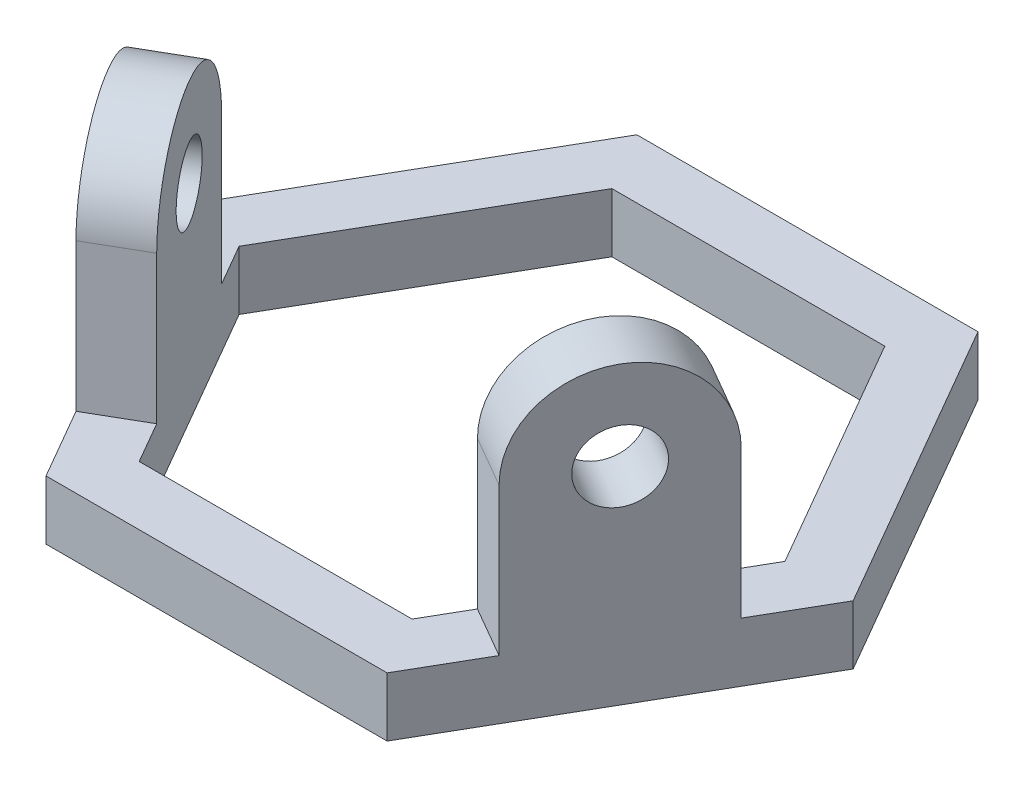
ISO-10303-21;
HEADER;
FILE_DESCRIPTION(('STEP AP214'),'2;1');
FILE_NAME('part.step','',(''),(''),'','','');
FILE_SCHEMA(('AUTOMOTIVE_DESIGN { 1 0 10303 214 1 1 1 1 }'));
ENDSEC;
DATA;
#1=APPLICATION_CONTEXT('core data for automotive mechanical design processes');
#2=APPLICATION_PROTOCOL_DEFINITION('international standard','automotive_design',2000,#1);
#3=PRODUCT_CONTEXT('',#1,'mechanical');
#4=PRODUCT('Part','Part','',(#3));
#5=PRODUCT_RELATED_PRODUCT_CATEGORY('part','',(#4));
#6=PRODUCT_DEFINITION_FORMATION('','',#4);
#7=PRODUCT_DEFINITION_CONTEXT('part definition',#1,'design');
#8=PRODUCT_DEFINITION('design','',#6,#7);
#9=PRODUCT_DEFINITION_SHAPE('','',#8);
#10=(LENGTH_UNIT() NAMED_UNIT(*) SI_UNIT(.MILLI.,.METRE.));
#11=(NAMED_UNIT(*) PLANE_ANGLE_UNIT() SI_UNIT($,.RADIAN.));
#12=(NAMED_UNIT(*) SI_UNIT($,.STERADIAN.) SOLID_ANGLE_UNIT());
#13=UNCERTAINTY_MEASURE_WITH_UNIT(LENGTH_MEASURE(1.E-05),#10,'distance_accuracy_value','');
#14=(GEOMETRIC_REPRESENTATION_CONTEXT(3) GLOBAL_UNCERTAINTY_ASSIGNED_CONTEXT((#13)) GLOBAL_UNIT_ASSIGNED_CONTEXT((#10,
#11,#12)) REPRESENTATION_CONTEXT('',''));
#15=CARTESIAN_POINT('',(0.,0.,0.));
#16=DIRECTION('',(0.,0.,1.));
#17=DIRECTION('',(1.,0.,0.));
#18=AXIS2_PLACEMENT_3D('',#15,#16,#17);
#19=CARTESIAN_POINT('',(0.,10.,0.));
#20=DIRECTION('',(0.,1.,0.));
#21=DIRECTION('',(0.,0.,1.));
#22=AXIS2_PLACEMENT_3D('',#19,#20,#21);
#23=PLANE('',#22);
#24=DIRECTION('',(0.5,0.,0.866025403784439));
#25=VECTOR('',#24,1.);
#26=CARTESIAN_POINT('',(-57.7350269189626,10.,0.));
#27=LINE('',#26,#25);
#28=CARTESIAN_POINT('',(-57.7350269189626,10.,0.));
#29=VERTEX_POINT('',#28);
#30=CARTESIAN_POINT('',(-50.801270189222,10.,12.0096189432334));
#31=VERTEX_POINT('',#30);
#32=EDGE_CURVE('E354',#29,#31,#27,.T.);
#33=ORIENTED_EDGE('',*,*,#32,.T.);
#34=DIRECTION('',(-0.866025403784438,0.,0.5));
#35=VECTOR('',#34,1.);
#36=CARTESIAN_POINT('',(-42.1410161513776,10.,7.00961894323344));
#37=LINE('',#36,#35);
#38=CARTESIAN_POINT('',(-42.1410161513776,10.,7.00961894323344));
#39=VERTEX_POINT('',#38);
#40=EDGE_CURVE('E224',#39,#31,#37,.T.);
#41=ORIENTED_EDGE('',*,*,#40,.F.);
#42=DIRECTION('',(0.5,0.,0.866025403784439));
#43=VECTOR('',#42,1.);
#44=CARTESIAN_POINT('',(-46.1880215351701,10.,0.));
#45=LINE('',#44,#43);
#46=CARTESIAN_POINT('',(-46.1880215351701,10.,0.));
#47=VERTEX_POINT('',#46);
#48=EDGE_CURVE('E289',#47,#39,#45,.T.);
#49=ORIENTED_EDGE('',*,*,#48,.F.);
#50=DIRECTION('',(-0.5,0.,0.866025403784439));
#51=VECTOR('',#50,1.);
#52=CARTESIAN_POINT('',(-23.094010767585,10.,-40.));
#53=LINE('',#52,#51);
#54=CARTESIAN_POINT('',(-23.094010767585,10.,-40.));
#55=VERTEX_POINT('',#54);
#56=EDGE_CURVE('E285',#55,#47,#53,.T.);
#57=ORIENTED_EDGE('',*,*,#56,.F.);
#58=DIRECTION('',(-1.,0.,0.));
#59=VECTOR('',#58,1.);
#60=CARTESIAN_POINT('',(23.094010767585,10.,-40.));
#61=LINE('',#60,#59);
#62=CARTESIAN_POINT('',(23.094010767585,10.,-40.));
#63=VERTEX_POINT('',#62);
#64=EDGE_CURVE('E282',#63,#55,#61,.T.);
#65=ORIENTED_EDGE('',*,*,#64,.F.);
#66=DIRECTION('',(-0.5,0.,-0.866025403784438));
#67=VECTOR('',#66,1.);
#68=CARTESIAN_POINT('',(46.1880215351701,10.,0.));
#69=LINE('',#68,#67);
#70=CARTESIAN_POINT('',(46.1880215351701,10.,0.));
#71=VERTEX_POINT('',#70);
#72=EDGE_CURVE('E278',#71,#63,#69,.T.);
#73=ORIENTED_EDGE('',*,*,#72,.F.);
#74=DIRECTION('',(0.5,0.,-0.866025403784439));
#75=VECTOR('',#74,1.);
#76=CARTESIAN_POINT('',(23.094010767585,10.,40.));
#77=LINE('',#76,#75);
#78=CARTESIAN_POINT('',(42.1410161513776,10.,7.00961894323344));
#79=VERTEX_POINT('',#78);
#80=EDGE_CURVE('E279',#79,#71,#77,.T.);
#81=ORIENTED_EDGE('',*,*,#80,.F.);
#82=DIRECTION('',(0.866025403784438,0.,0.5));
#83=VECTOR('',#82,1.);
#84=CARTESIAN_POINT('',(42.1410161513776,10.,7.00961894323344));
#85=LINE('',#84,#83);
#86=CARTESIAN_POINT('',(50.8012701892219,10.,12.0096189432334));
#87=VERTEX_POINT('',#86);
#88=EDGE_CURVE('E252',#79,#87,#85,.T.);
#89=ORIENTED_EDGE('',*,*,#88,.T.);
#90=DIRECTION('',(0.5,0.,-0.866025403784439));
#91=VECTOR('',#90,1.);
#92=CARTESIAN_POINT('',(28.8675134594813,10.,50.));
#93=LINE('',#92,#91);
#94=CARTESIAN_POINT('',(57.7350269189626,10.,0.));
#95=VERTEX_POINT('',#94);
#96=EDGE_CURVE('E344',#87,#95,#93,.T.);
#97=ORIENTED_EDGE('',*,*,#96,.T.);
#98=DIRECTION('',(-0.5,0.,-0.866025403784438));
#99=VECTOR('',#98,1.);
#100=CARTESIAN_POINT('',(57.7350269189626,10.,0.));
#101=LINE('',#100,#99);
#102=CARTESIAN_POINT('',(28.8675134594813,10.,-50.));
#103=VERTEX_POINT('',#102);
#104=EDGE_CURVE('E343',#95,#103,#101,.T.);
#105=ORIENTED_EDGE('',*,*,#104,.T.);
#106=DIRECTION('',(-1.,0.,0.));
#107=VECTOR('',#106,1.);
#108=CARTESIAN_POINT('',(28.8675134594813,10.,-50.));
#109=LINE('',#108,#107);
#110=CARTESIAN_POINT('',(-28.8675134594813,10.,-50.));
#111=VERTEX_POINT('',#110);
#112=EDGE_CURVE('E347',#103,#111,#109,.T.);
#113=ORIENTED_EDGE('',*,*,#112,.T.);
#114=DIRECTION('',(-0.5,0.,0.866025403784439));
#115=VECTOR('',#114,1.);
#116=CARTESIAN_POINT('',(-28.8675134594813,10.,-50.));
#117=LINE('',#116,#115);
#118=EDGE_CURVE('E350',#111,#29,#117,.T.);
#119=ORIENTED_EDGE('',*,*,#118,.T.);
#120=EDGE_LOOP('',(#33,#41,#49,#57,#65,#73,#81,#89,#97,#105,#113,#119));
#121=FACE_BOUND('',#120,.T.);
#122=ADVANCED_FACE('F45',(#121),#23,.T.);
#123=CARTESIAN_POINT('',(-27.1410161513776,10.,32.9903810567665));
#124=VERTEX_POINT('',#123);
#125=CARTESIAN_POINT('',(-23.094010767585,10.,40.));
#126=VERTEX_POINT('',#125);
#127=EDGE_CURVE('E288',#124,#126,#45,.T.);
#128=ORIENTED_EDGE('',*,*,#127,.F.);
#129=DIRECTION('',(-0.866025403784438,0.,0.5));
#130=VECTOR('',#129,1.);
#131=CARTESIAN_POINT('',(-27.1410161513776,10.,32.9903810567666));
#132=LINE('',#131,#130);
#133=CARTESIAN_POINT('',(-35.8012701892219,10.,37.9903810567666));
#134=VERTEX_POINT('',#133);
#135=EDGE_CURVE('E61',#124,#134,#132,.T.);
#136=ORIENTED_EDGE('',*,*,#135,.T.);
#137=CARTESIAN_POINT('',(-28.8675134594813,10.,50.));
#138=VERTEX_POINT('',#137);
#139=EDGE_CURVE('E353',#134,#138,#27,.T.);
#140=ORIENTED_EDGE('',*,*,#139,.T.);
#141=DIRECTION('',(1.,0.,0.));
#142=VECTOR('',#141,1.);
#143=CARTESIAN_POINT('',(-28.8675134594813,10.,50.));
#144=LINE('',#143,#142);
#145=CARTESIAN_POINT('',(28.8675134594813,10.,50.));
#146=VERTEX_POINT('',#145);
#147=EDGE_CURVE('E358',#138,#146,#144,.T.);
#148=ORIENTED_EDGE('',*,*,#147,.T.);
#149=CARTESIAN_POINT('',(35.8012701892219,10.,37.9903810567666));
#150=VERTEX_POINT('',#149);
#151=EDGE_CURVE('E339',#146,#150,#93,.T.);
#152=ORIENTED_EDGE('',*,*,#151,.T.);
#153=DIRECTION('',(0.866025403784438,0.,0.5));
#154=VECTOR('',#153,1.);
#155=CARTESIAN_POINT('',(27.1410161513776,10.,32.9903810567666));
#156=LINE('',#155,#154);
#157=CARTESIAN_POINT('',(27.1410161513776,10.,32.9903810567666));
#158=VERTEX_POINT('',#157);
#159=EDGE_CURVE('E262',#158,#150,#156,.T.);
#160=ORIENTED_EDGE('',*,*,#159,.F.);
#161=CARTESIAN_POINT('',(23.094010767585,10.,40.));
#162=VERTEX_POINT('',#161);
#163=EDGE_CURVE('E274',#162,#158,#77,.T.);
#164=ORIENTED_EDGE('',*,*,#163,.F.);
#165=DIRECTION('',(1.,0.,0.));
#166=VECTOR('',#165,1.);
#167=CARTESIAN_POINT('',(-23.094010767585,10.,40.));
#168=LINE('',#167,#166);
#169=EDGE_CURVE('E292',#126,#162,#168,.T.);
#170=ORIENTED_EDGE('',*,*,#169,.F.);
#171=EDGE_LOOP('',(#128,#136,#140,#148,#152,#160,#164,#170));
#172=FACE_BOUND('',#171,.T.);
#173=ADVANCED_FACE('F467',(#172),#23,.T.);
#174=CARTESIAN_POINT('',(0.,0.,0.));
#175=DIRECTION('',(0.,1.,0.));
#176=DIRECTION('',(0.,0.,1.));
#177=AXIS2_PLACEMENT_3D('',#174,#175,#176);
#178=PLANE('',#177);
#179=DIRECTION('',(0.5,0.,-0.866025403784439));
#180=VECTOR('',#179,1.);
#181=CARTESIAN_POINT('',(28.8675134594813,0.,50.));
#182=LINE('',#181,#180);
#183=CARTESIAN_POINT('',(28.8675134594813,0.,50.));
#184=VERTEX_POINT('',#183);
#185=CARTESIAN_POINT('',(57.7350269189626,0.,0.));
#186=VERTEX_POINT('',#185);
#187=EDGE_CURVE('E338',#184,#186,#182,.T.);
#188=ORIENTED_EDGE('',*,*,#187,.F.);
#189=DIRECTION('',(1.,0.,0.));
#190=VECTOR('',#189,1.);
#191=CARTESIAN_POINT('',(-28.8675134594813,0.,50.));
#192=LINE('',#191,#190);
#193=CARTESIAN_POINT('',(-28.8675134594813,0.,50.));
#194=VERTEX_POINT('',#193);
#195=EDGE_CURVE('E377',#194,#184,#192,.T.);
#196=ORIENTED_EDGE('',*,*,#195,.F.);
#197=DIRECTION('',(0.5,0.,0.866025403784439));
#198=VECTOR('',#197,1.);
#199=CARTESIAN_POINT('',(-57.7350269189626,0.,0.));
#200=LINE('',#199,#198);
#201=CARTESIAN_POINT('',(-57.7350269189626,0.,0.));
#202=VERTEX_POINT('',#201);
#203=EDGE_CURVE('E374',#202,#194,#200,.T.);
#204=ORIENTED_EDGE('',*,*,#203,.F.);
#205=DIRECTION('',(-0.5,0.,0.866025403784439));
#206=VECTOR('',#205,1.);
#207=CARTESIAN_POINT('',(-28.8675134594813,0.,-50.));
#208=LINE('',#207,#206);
#209=CARTESIAN_POINT('',(-28.8675134594813,0.,-50.));
#210=VERTEX_POINT('',#209);
#211=EDGE_CURVE('E371',#210,#202,#208,.T.);
#212=ORIENTED_EDGE('',*,*,#211,.F.);
#213=DIRECTION('',(-1.,0.,0.));
#214=VECTOR('',#213,1.);
#215=CARTESIAN_POINT('',(28.8675134594813,0.,-50.));
#216=LINE('',#215,#214);
#217=CARTESIAN_POINT('',(28.8675134594813,0.,-50.));
#218=VERTEX_POINT('',#217);
#219=EDGE_CURVE('E368',#218,#210,#216,.T.);
#220=ORIENTED_EDGE('',*,*,#219,.F.);
#221=DIRECTION('',(-0.5,0.,-0.866025403784438));
#222=VECTOR('',#221,1.);
#223=CARTESIAN_POINT('',(57.7350269189626,0.,0.));
#224=LINE('',#223,#222);
#225=EDGE_CURVE('E365',#186,#218,#224,.T.);
#226=ORIENTED_EDGE('',*,*,#225,.F.);
#227=EDGE_LOOP('',(#188,#196,#204,#212,#220,#226));
#228=FACE_BOUND('',#227,.T.);
#229=DIRECTION('',(0.5,0.,-0.866025403784439));
#230=VECTOR('',#229,1.);
#231=CARTESIAN_POINT('',(23.094010767585,0.,40.));
#232=LINE('',#231,#230);
#233=CARTESIAN_POINT('',(23.094010767585,0.,40.));
#234=VERTEX_POINT('',#233);
#235=CARTESIAN_POINT('',(46.1880215351701,0.,0.));
#236=VERTEX_POINT('',#235);
#237=EDGE_CURVE('E265',#234,#236,#232,.T.);
#238=ORIENTED_EDGE('',*,*,#237,.T.);
#239=DIRECTION('',(-0.5,0.,-0.866025403784438));
#240=VECTOR('',#239,1.);
#241=CARTESIAN_POINT('',(46.1880215351701,0.,0.));
#242=LINE('',#241,#240);
#243=CARTESIAN_POINT('',(23.094010767585,0.,-40.));
#244=VERTEX_POINT('',#243);
#245=EDGE_CURVE('E299',#236,#244,#242,.T.);
#246=ORIENTED_EDGE('',*,*,#245,.T.);
#247=DIRECTION('',(-1.,0.,0.));
#248=VECTOR('',#247,1.);
#249=CARTESIAN_POINT('',(23.094010767585,0.,-40.));
#250=LINE('',#249,#248);
#251=CARTESIAN_POINT('',(-23.094010767585,0.,-40.));
#252=VERTEX_POINT('',#251);
#253=EDGE_CURVE('E303',#244,#252,#250,.T.);
#254=ORIENTED_EDGE('',*,*,#253,.T.);
#255=DIRECTION('',(-0.5,0.,0.866025403784439));
#256=VECTOR('',#255,1.);
#257=CARTESIAN_POINT('',(-23.094010767585,0.,-40.));
#258=LINE('',#257,#256);
#259=CARTESIAN_POINT('',(-46.1880215351701,0.,0.));
#260=VERTEX_POINT('',#259);
#261=EDGE_CURVE('E307',#252,#260,#258,.T.);
#262=ORIENTED_EDGE('',*,*,#261,.T.);
#263=DIRECTION('',(0.5,0.,0.866025403784439));
#264=VECTOR('',#263,1.);
#265=CARTESIAN_POINT('',(-46.1880215351701,0.,0.));
#266=LINE('',#265,#264);
#267=CARTESIAN_POINT('',(-23.094010767585,0.,40.));
#268=VERTEX_POINT('',#267);
#269=EDGE_CURVE('E311',#260,#268,#266,.T.);
#270=ORIENTED_EDGE('',*,*,#269,.T.);
#271=DIRECTION('',(1.,0.,0.));
#272=VECTOR('',#271,1.);
#273=CARTESIAN_POINT('',(-23.094010767585,0.,40.));
#274=LINE('',#273,#272);
#275=EDGE_CURVE('E315',#268,#234,#274,.T.);
#276=ORIENTED_EDGE('',*,*,#275,.T.);
#277=EDGE_LOOP('',(#238,#246,#254,#262,#270,#276));
#278=FACE_BOUND('',#277,.T.);
#279=ADVANCED_FACE('F407',(#228,#278),#178,.F.);
#280=CARTESIAN_POINT('',(28.8675134594813,10.,50.));
#281=DIRECTION('',(-0.866025403784438,0.,-0.5));
#282=DIRECTION('',(-0.5,0.,0.866025403784439));
#283=AXIS2_PLACEMENT_3D('',#280,#281,#282);
#284=PLANE('',#283);
#285=ORIENTED_EDGE('',*,*,#187,.T.);
#286=DIRECTION('',(0.,-1.,0.));
#287=VECTOR('',#286,1.);
#288=CARTESIAN_POINT('',(57.7350269189626,10.,0.));
#289=LINE('',#288,#287);
#290=EDGE_CURVE('E11',#95,#186,#289,.T.);
#291=ORIENTED_EDGE('',*,*,#290,.F.);
#292=ORIENTED_EDGE('',*,*,#96,.F.);
#293=DIRECTION('',(0.,1.,0.));
#294=VECTOR('',#293,1.);
#295=CARTESIAN_POINT('',(50.801270189222,35.,12.0096189432334));
#296=LINE('',#295,#294);
#297=CARTESIAN_POINT('',(50.801270189222,35.,12.0096189432334));
#298=VERTEX_POINT('',#297);
#299=EDGE_CURVE('E69',#87,#298,#296,.T.);
#300=ORIENTED_EDGE('',*,*,#299,.T.);
#301=CARTESIAN_POINT('',(43.3012701892219,35.,25.));
#302=DIRECTION('',(0.866025403784438,0.,0.5));
#303=DIRECTION('',(-0.5,0.,0.866025403784438));
#304=AXIS2_PLACEMENT_3D('',#301,#302,#303);
#305=CIRCLE('',#304,15.);
#306=CARTESIAN_POINT('',(35.8012701892219,35.,37.9903810567666));
#307=VERTEX_POINT('',#306);
#308=EDGE_CURVE('E255',#298,#307,#305,.T.);
#309=ORIENTED_EDGE('',*,*,#308,.T.);
#310=DIRECTION('',(0.,-1.,0.));
#311=VECTOR('',#310,1.);
#312=CARTESIAN_POINT('',(35.8012701892219,10.,37.9903810567666));
#313=LINE('',#312,#311);
#314=EDGE_CURVE('E245',#307,#150,#313,.T.);
#315=ORIENTED_EDGE('',*,*,#314,.T.);
#316=ORIENTED_EDGE('',*,*,#151,.F.);
#317=DIRECTION('',(0.,-1.,0.));
#318=VECTOR('',#317,1.);
#319=CARTESIAN_POINT('',(28.8675134594813,10.,50.));
#320=LINE('',#319,#318);
#321=EDGE_CURVE('E361',#146,#184,#320,.T.);
#322=ORIENTED_EDGE('',*,*,#321,.T.);
#323=EDGE_LOOP('',(#285,#291,#292,#300,#309,#315,#316,#322));
#324=FACE_BOUND('',#323,.T.);
#325=CARTESIAN_POINT('',(43.3012701892219,35.,25.));
#326=DIRECTION('',(0.866025403784438,0.,0.5));
#327=DIRECTION('',(0.5,0.,-0.866025403784438));
#328=AXIS2_PLACEMENT_3D('',#325,#326,#327);
#329=CIRCLE('',#328,6.);
#330=CARTESIAN_POINT('',(46.301270189222,35.,19.8038475772934));
#331=VERTEX_POINT('',#330);
#332=EDGE_CURVE('E228',#331,#331,#329,.T.);
#333=ORIENTED_EDGE('',*,*,#332,.F.);
#334=EDGE_LOOP('',(#333));
#335=FACE_BOUND('',#334,.T.);
#336=ADVANCED_FACE('F47',(#324,#335),#284,.F.);
#337=CARTESIAN_POINT('',(57.7350269189626,10.,0.));
#338=DIRECTION('',(-0.866025403784438,0.,0.5));
#339=DIRECTION('',(0.5,0.,0.866025403784438));
#340=AXIS2_PLACEMENT_3D('',#337,#338,#339);
#341=PLANE('',#340);
#342=ORIENTED_EDGE('',*,*,#225,.T.);
#343=DIRECTION('',(0.,-1.,0.));
#344=VECTOR('',#343,1.);
#345=CARTESIAN_POINT('',(28.8675134594813,10.,-50.));
#346=LINE('',#345,#344);
#347=EDGE_CURVE('E54',#103,#218,#346,.T.);
#348=ORIENTED_EDGE('',*,*,#347,.F.);
#349=ORIENTED_EDGE('',*,*,#104,.F.);
#350=ORIENTED_EDGE('',*,*,#290,.T.);
#351=EDGE_LOOP('',(#342,#348,#349,#350));
#352=FACE_BOUND('',#351,.T.);
#353=ADVANCED_FACE('F425',(#352),#341,.F.);
#354=CARTESIAN_POINT('',(28.8675134594813,10.,-50.));
#355=DIRECTION('',(0.,0.,1.));
#356=DIRECTION('',(1.,0.,0.));
#357=AXIS2_PLACEMENT_3D('',#354,#355,#356);
#358=PLANE('',#357);
#359=ORIENTED_EDGE('',*,*,#219,.T.);
#360=DIRECTION('',(0.,-1.,0.));
#361=VECTOR('',#360,1.);
#362=CARTESIAN_POINT('',(-28.8675134594813,10.,-50.));
#363=LINE('',#362,#361);
#364=EDGE_CURVE('E391',#111,#210,#363,.T.);
#365=ORIENTED_EDGE('',*,*,#364,.F.);
#366=ORIENTED_EDGE('',*,*,#112,.F.);
#367=ORIENTED_EDGE('',*,*,#347,.T.);
#368=EDGE_LOOP('',(#359,#365,#366,#367));
#369=FACE_BOUND('',#368,.T.);
#370=ADVANCED_FACE('F400',(#369),#358,.F.);
#371=CARTESIAN_POINT('',(-28.8675134594813,10.,-50.));
#372=DIRECTION('',(0.866025403784439,0.,0.5));
#373=DIRECTION('',(0.5,0.,-0.866025403784439));
#374=AXIS2_PLACEMENT_3D('',#371,#372,#373);
#375=PLANE('',#374);
#376=ORIENTED_EDGE('',*,*,#211,.T.);
#377=DIRECTION('',(0.,-1.,0.));
#378=VECTOR('',#377,1.);
#379=CARTESIAN_POINT('',(-57.7350269189626,10.,0.));
#380=LINE('',#379,#378);
#381=EDGE_CURVE('E387',#29,#202,#380,.T.);
#382=ORIENTED_EDGE('',*,*,#381,.F.);
#383=ORIENTED_EDGE('',*,*,#118,.F.);
#384=ORIENTED_EDGE('',*,*,#364,.T.);
#385=EDGE_LOOP('',(#376,#382,#383,#384));
#386=FACE_BOUND('',#385,.T.);
#387=ADVANCED_FACE('F413',(#386),#375,.F.);
#388=CARTESIAN_POINT('',(-57.7350269189626,10.,0.));
#389=DIRECTION('',(0.866025403784438,0.,-0.5));
#390=DIRECTION('',(-0.5,0.,-0.866025403784438));
#391=AXIS2_PLACEMENT_3D('',#388,#389,#390);
#392=PLANE('',#391);
#393=ORIENTED_EDGE('',*,*,#203,.T.);
#394=DIRECTION('',(0.,-1.,0.));
#395=VECTOR('',#394,1.);
#396=CARTESIAN_POINT('',(-28.8675134594813,10.,50.));
#397=LINE('',#396,#395);
#398=EDGE_CURVE('E383',#138,#194,#397,.T.);
#399=ORIENTED_EDGE('',*,*,#398,.F.);
#400=ORIENTED_EDGE('',*,*,#139,.F.);
#401=DIRECTION('',(0.,-1.,0.));
#402=VECTOR('',#401,1.);
#403=CARTESIAN_POINT('',(-35.8012701892219,10.,37.9903810567666));
#404=LINE('',#403,#402);
#405=CARTESIAN_POINT('',(-35.8012701892219,35.,37.9903810567666));
#406=VERTEX_POINT('',#405);
#407=EDGE_CURVE('E218',#406,#134,#404,.T.);
#408=ORIENTED_EDGE('',*,*,#407,.F.);
#409=CARTESIAN_POINT('',(-43.3012701892219,35.,25.));
#410=DIRECTION('',(0.866025403784438,0.,-0.5));
#411=DIRECTION('',(0.5,0.,0.866025403784438));
#412=AXIS2_PLACEMENT_3D('',#409,#410,#411);
#413=CIRCLE('',#412,15.);
#414=CARTESIAN_POINT('',(-50.801270189222,35.,12.0096189432334));
#415=VERTEX_POINT('',#414);
#416=EDGE_CURVE('E201',#415,#406,#413,.T.);
#417=ORIENTED_EDGE('',*,*,#416,.F.);
#418=DIRECTION('',(0.,1.,0.));
#419=VECTOR('',#418,1.);
#420=CARTESIAN_POINT('',(-50.801270189222,35.,12.0096189432334));
#421=LINE('',#420,#419);
#422=EDGE_CURVE('E208',#31,#415,#421,.T.);
#423=ORIENTED_EDGE('',*,*,#422,.F.);
#424=ORIENTED_EDGE('',*,*,#32,.F.);
#425=ORIENTED_EDGE('',*,*,#381,.T.);
#426=EDGE_LOOP('',(#393,#399,#400,#408,#417,#423,#424,#425));
#427=FACE_BOUND('',#426,.T.);
#428=CARTESIAN_POINT('',(-43.3012701892219,35.,25.));
#429=DIRECTION('',(0.866025403784438,0.,-0.5));
#430=DIRECTION('',(-0.5,0.,-0.866025403784438));
#431=AXIS2_PLACEMENT_3D('',#428,#429,#430);
#432=CIRCLE('',#431,6.);
#433=CARTESIAN_POINT('',(-46.301270189222,35.,19.8038475772934));
#434=VERTEX_POINT('',#433);
#435=EDGE_CURVE('E213',#434,#434,#432,.T.);
#436=ORIENTED_EDGE('',*,*,#435,.T.);
#437=EDGE_LOOP('',(#436));
#438=FACE_BOUND('',#437,.T.);
#439=ADVANCED_FACE('F417',(#427,#438),#392,.F.);
#440=CARTESIAN_POINT('',(-28.8675134594813,10.,50.));
#441=DIRECTION('',(0.,0.,-1.));
#442=DIRECTION('',(-1.,0.,0.));
#443=AXIS2_PLACEMENT_3D('',#440,#441,#442);
#444=PLANE('',#443);
#445=ORIENTED_EDGE('',*,*,#195,.T.);
#446=ORIENTED_EDGE('',*,*,#321,.F.);
#447=ORIENTED_EDGE('',*,*,#147,.F.);
#448=ORIENTED_EDGE('',*,*,#398,.T.);
#449=EDGE_LOOP('',(#445,#446,#447,#448));
#450=FACE_BOUND('',#449,.T.);
#451=ADVANCED_FACE('F431',(#450),#444,.F.);
#452=CARTESIAN_POINT('',(23.094010767585,10.,40.));
#453=DIRECTION('',(-0.866025403784439,0.,-0.5));
#454=DIRECTION('',(-0.5,0.,0.866025403784439));
#455=AXIS2_PLACEMENT_3D('',#452,#453,#454);
#456=PLANE('',#455);
#457=ORIENTED_EDGE('',*,*,#237,.F.);
#458=DIRECTION('',(0.,-1.,0.));
#459=VECTOR('',#458,1.);
#460=CARTESIAN_POINT('',(23.094010767585,10.,40.));
#461=LINE('',#460,#459);
#462=EDGE_CURVE('E295',#162,#234,#461,.T.);
#463=ORIENTED_EDGE('',*,*,#462,.F.);
#464=ORIENTED_EDGE('',*,*,#163,.T.);
#465=DIRECTION('',(0.,-1.,0.));
#466=VECTOR('',#465,1.);
#467=CARTESIAN_POINT('',(27.1410161513776,10.,32.9903810567666));
#468=LINE('',#467,#466);
#469=CARTESIAN_POINT('',(27.1410161513776,35.,32.9903810567666));
#470=VERTEX_POINT('',#469);
#471=EDGE_CURVE('E249',#470,#158,#468,.T.);
#472=ORIENTED_EDGE('',*,*,#471,.F.);
#473=CARTESIAN_POINT('',(34.6410161513776,35.,20.));
#474=DIRECTION('',(0.866025403784438,0.,0.5));
#475=DIRECTION('',(-0.5,0.,0.866025403784438));
#476=AXIS2_PLACEMENT_3D('',#473,#474,#475);
#477=CIRCLE('',#476,15.);
#478=CARTESIAN_POINT('',(42.1410161513776,35.,7.00961894323344));
#479=VERTEX_POINT('',#478);
#480=EDGE_CURVE('E244',#479,#470,#477,.T.);
#481=ORIENTED_EDGE('',*,*,#480,.F.);
#482=DIRECTION('',(0.,1.,0.));
#483=VECTOR('',#482,1.);
#484=CARTESIAN_POINT('',(42.1410161513776,35.,7.00961894323344));
#485=LINE('',#484,#483);
#486=EDGE_CURVE('E240',#79,#479,#485,.T.);
#487=ORIENTED_EDGE('',*,*,#486,.F.);
#488=ORIENTED_EDGE('',*,*,#80,.T.);
#489=DIRECTION('',(0.,-1.,0.));
#490=VECTOR('',#489,1.);
#491=CARTESIAN_POINT('',(46.1880215351701,10.,0.));
#492=LINE('',#491,#490);
#493=EDGE_CURVE('E334',#71,#236,#492,.T.);
#494=ORIENTED_EDGE('',*,*,#493,.T.);
#495=EDGE_LOOP('',(#457,#463,#464,#472,#481,#487,#488,#494));
#496=FACE_BOUND('',#495,.T.);
#497=CARTESIAN_POINT('',(34.6410161513776,35.,20.));
#498=DIRECTION('',(0.866025403784438,0.,0.5));
#499=DIRECTION('',(0.5,0.,-0.866025403784438));
#500=AXIS2_PLACEMENT_3D('',#497,#498,#499);
#501=CIRCLE('',#500,6.);
#502=CARTESIAN_POINT('',(37.6410161513776,35.,14.8038475772934));
#503=VERTEX_POINT('',#502);
#504=EDGE_CURVE('E233',#503,#503,#501,.T.);
#505=ORIENTED_EDGE('',*,*,#504,.T.);
#506=EDGE_LOOP('',(#505));
#507=FACE_BOUND('',#506,.T.);
#508=ADVANCED_FACE('F443',(#496,#507),#456,.T.);
#509=CARTESIAN_POINT('',(46.1880215351701,10.,0.));
#510=DIRECTION('',(-0.866025403784438,0.,0.5));
#511=DIRECTION('',(0.5,0.,0.866025403784438));
#512=AXIS2_PLACEMENT_3D('',#509,#510,#511);
#513=PLANE('',#512);
#514=ORIENTED_EDGE('',*,*,#245,.F.);
#515=ORIENTED_EDGE('',*,*,#493,.F.);
#516=ORIENTED_EDGE('',*,*,#72,.T.);
#517=DIRECTION('',(0.,-1.,0.));
#518=VECTOR('',#517,1.);
#519=CARTESIAN_POINT('',(23.094010767585,10.,-40.));
#520=LINE('',#519,#518);
#521=EDGE_CURVE('E331',#63,#244,#520,.T.);
#522=ORIENTED_EDGE('',*,*,#521,.T.);
#523=EDGE_LOOP('',(#514,#515,#516,#522));
#524=FACE_BOUND('',#523,.T.);
#525=ADVANCED_FACE('F448',(#524),#513,.T.);
#526=CARTESIAN_POINT('',(23.094010767585,10.,-40.));
#527=DIRECTION('',(0.,0.,1.));
#528=DIRECTION('',(1.,0.,0.));
#529=AXIS2_PLACEMENT_3D('',#526,#527,#528);
#530=PLANE('',#529);
#531=ORIENTED_EDGE('',*,*,#253,.F.);
#532=ORIENTED_EDGE('',*,*,#521,.F.);
#533=ORIENTED_EDGE('',*,*,#64,.T.);
#534=DIRECTION('',(0.,-1.,0.));
#535=VECTOR('',#534,1.);
#536=CARTESIAN_POINT('',(-23.094010767585,10.,-40.));
#537=LINE('',#536,#535);
#538=EDGE_CURVE('E328',#55,#252,#537,.T.);
#539=ORIENTED_EDGE('',*,*,#538,.T.);
#540=EDGE_LOOP('',(#531,#532,#533,#539));
#541=FACE_BOUND('',#540,.T.);
#542=ADVANCED_FACE('F455',(#541),#530,.T.);
#543=CARTESIAN_POINT('',(-23.094010767585,10.,-40.));
#544=DIRECTION('',(0.866025403784439,0.,0.5));
#545=DIRECTION('',(0.5,0.,-0.866025403784439));
#546=AXIS2_PLACEMENT_3D('',#543,#544,#545);
#547=PLANE('',#546);
#548=ORIENTED_EDGE('',*,*,#261,.F.);
#549=ORIENTED_EDGE('',*,*,#538,.F.);
#550=ORIENTED_EDGE('',*,*,#56,.T.);
#551=DIRECTION('',(0.,-1.,0.));
#552=VECTOR('',#551,1.);
#553=CARTESIAN_POINT('',(-46.1880215351701,10.,0.));
#554=LINE('',#553,#552);
#555=EDGE_CURVE('E325',#47,#260,#554,.T.);
#556=ORIENTED_EDGE('',*,*,#555,.T.);
#557=EDGE_LOOP('',(#548,#549,#550,#556));
#558=FACE_BOUND('',#557,.T.);
#559=ADVANCED_FACE('F458',(#558),#547,.T.);
#560=CARTESIAN_POINT('',(-46.1880215351701,10.,0.));
#561=DIRECTION('',(0.866025403784438,0.,-0.5));
#562=DIRECTION('',(-0.5,0.,-0.866025403784439));
#563=AXIS2_PLACEMENT_3D('',#560,#561,#562);
#564=PLANE('',#563);
#565=ORIENTED_EDGE('',*,*,#269,.F.);
#566=ORIENTED_EDGE('',*,*,#555,.F.);
#567=ORIENTED_EDGE('',*,*,#48,.T.);
#568=DIRECTION('',(0.,1.,0.));
#569=VECTOR('',#568,1.);
#570=CARTESIAN_POINT('',(-42.1410161513776,35.,7.00961894323344));
#571=LINE('',#570,#569);
#572=CARTESIAN_POINT('',(-42.1410161513776,35.,7.00961894323344));
#573=VERTEX_POINT('',#572);
#574=EDGE_CURVE('E191',#39,#573,#571,.T.);
#575=ORIENTED_EDGE('',*,*,#574,.T.);
#576=CARTESIAN_POINT('',(-34.6410161513776,35.,20.));
#577=DIRECTION('',(0.866025403784438,0.,-0.5));
#578=DIRECTION('',(0.5,0.,0.866025403784438));
#579=AXIS2_PLACEMENT_3D('',#576,#577,#578);
#580=CIRCLE('',#579,15.);
#581=CARTESIAN_POINT('',(-27.1410161513776,35.,32.9903810567666));
#582=VERTEX_POINT('',#581);
#583=EDGE_CURVE('E183',#573,#582,#580,.T.);
#584=ORIENTED_EDGE('',*,*,#583,.T.);
#585=DIRECTION('',(0.,-1.,0.));
#586=VECTOR('',#585,1.);
#587=CARTESIAN_POINT('',(-27.1410161513776,10.,32.9903810567666));
#588=LINE('',#587,#586);
#589=EDGE_CURVE('E188',#582,#124,#588,.T.);
#590=ORIENTED_EDGE('',*,*,#589,.T.);
#591=ORIENTED_EDGE('',*,*,#127,.T.);
#592=DIRECTION('',(0.,-1.,0.));
#593=VECTOR('',#592,1.);
#594=CARTESIAN_POINT('',(-23.094010767585,10.,40.));
#595=LINE('',#594,#593);
#596=EDGE_CURVE('E322',#126,#268,#595,.T.);
#597=ORIENTED_EDGE('',*,*,#596,.T.);
#598=EDGE_LOOP('',(#565,#566,#567,#575,#584,#590,#591,#597));
#599=FACE_BOUND('',#598,.T.);
#600=CARTESIAN_POINT('',(-34.6410161513776,35.,20.));
#601=DIRECTION('',(0.866025403784438,0.,-0.5));
#602=DIRECTION('',(-0.5,0.,-0.866025403784438));
#603=AXIS2_PLACEMENT_3D('',#600,#601,#602);
#604=CIRCLE('',#603,6.);
#605=CARTESIAN_POINT('',(-37.6410161513776,35.,14.8038475772934));
#606=VERTEX_POINT('',#605);
#607=EDGE_CURVE('E221',#606,#606,#604,.T.);
#608=ORIENTED_EDGE('',*,*,#607,.F.);
#609=EDGE_LOOP('',(#608));
#610=FACE_BOUND('',#609,.T.);
#611=ADVANCED_FACE('F186',(#599,#610),#564,.T.);
#612=CARTESIAN_POINT('',(-23.094010767585,10.,40.));
#613=DIRECTION('',(0.,0.,-1.));
#614=DIRECTION('',(-1.,0.,0.));
#615=AXIS2_PLACEMENT_3D('',#612,#613,#614);
#616=PLANE('',#615);
#617=ORIENTED_EDGE('',*,*,#275,.F.);
#618=ORIENTED_EDGE('',*,*,#596,.F.);
#619=ORIENTED_EDGE('',*,*,#169,.T.);
#620=ORIENTED_EDGE('',*,*,#462,.T.);
#621=EDGE_LOOP('',(#617,#618,#619,#620));
#622=FACE_BOUND('',#621,.T.);
#623=ADVANCED_FACE('F464',(#622),#616,.T.);
#624=CARTESIAN_POINT('',(27.1410161513776,10.,32.9903810567666));
#625=DIRECTION('',(-0.5,0.,0.866025403784438));
#626=DIRECTION('',(0.866025403784438,0.,0.5));
#627=AXIS2_PLACEMENT_3D('',#624,#625,#626);
#628=PLANE('',#627);
#629=ORIENTED_EDGE('',*,*,#314,.F.);
#630=DIRECTION('',(0.866025403784438,0.,0.5));
#631=VECTOR('',#630,1.);
#632=CARTESIAN_POINT('',(27.1410161513776,35.,32.9903810567666));
#633=LINE('',#632,#631);
#634=EDGE_CURVE('E266',#470,#307,#633,.T.);
#635=ORIENTED_EDGE('',*,*,#634,.F.);
#636=ORIENTED_EDGE('',*,*,#471,.T.);
#637=ORIENTED_EDGE('',*,*,#159,.T.);
#638=EDGE_LOOP('',(#629,#635,#636,#637));
#639=FACE_BOUND('',#638,.T.);
#640=ADVANCED_FACE('F472',(#639),#628,.T.);
#641=CARTESIAN_POINT('',(34.6410161513776,35.,20.));
#642=DIRECTION('',(0.866025403784438,0.,0.5));
#643=DIRECTION('',(0.5,0.,-0.866025403784438));
#644=AXIS2_PLACEMENT_3D('',#641,#642,#643);
#645=CYLINDRICAL_SURFACE('',#644,15.);
#646=ORIENTED_EDGE('',*,*,#308,.F.);
#647=DIRECTION('',(0.866025403784438,0.,0.5));
#648=VECTOR('',#647,1.);
#649=CARTESIAN_POINT('',(42.1410161513776,35.,7.00961894323344));
#650=LINE('',#649,#648);
#651=EDGE_CURVE('E269',#479,#298,#650,.T.);
#652=ORIENTED_EDGE('',*,*,#651,.F.);
#653=ORIENTED_EDGE('',*,*,#480,.T.);
#654=ORIENTED_EDGE('',*,*,#634,.T.);
#655=EDGE_LOOP('',(#646,#652,#653,#654));
#656=FACE_BOUND('',#655,.T.);
#657=ADVANCED_FACE('F475',(#656),#645,.T.);
#658=CARTESIAN_POINT('',(42.1410161513776,35.,7.00961894323344));
#659=DIRECTION('',(0.5,0.,-0.866025403784438));
#660=DIRECTION('',(-0.866025403784438,0.,-0.5));
#661=AXIS2_PLACEMENT_3D('',#658,#659,#660);
#662=PLANE('',#661);
#663=ORIENTED_EDGE('',*,*,#299,.F.);
#664=ORIENTED_EDGE('',*,*,#88,.F.);
#665=ORIENTED_EDGE('',*,*,#486,.T.);
#666=ORIENTED_EDGE('',*,*,#651,.T.);
#667=EDGE_LOOP('',(#663,#664,#665,#666));
#668=FACE_BOUND('',#667,.T.);
#669=ADVANCED_FACE('F476',(#668),#662,.T.);
#670=CARTESIAN_POINT('',(34.6410161513776,35.,20.));
#671=DIRECTION('',(0.866025403784438,0.,0.5));
#672=DIRECTION('',(0.5,0.,-0.866025403784438));
#673=AXIS2_PLACEMENT_3D('',#670,#671,#672);
#674=CYLINDRICAL_SURFACE('',#673,6.);
#675=ORIENTED_EDGE('',*,*,#504,.F.);
#676=EDGE_LOOP('',(#675));
#677=FACE_BOUND('',#676,.T.);
#678=ORIENTED_EDGE('',*,*,#332,.T.);
#679=EDGE_LOOP('',(#678));
#680=FACE_BOUND('',#679,.T.);
#681=ADVANCED_FACE('F478',(#677,#680),#674,.F.);
#682=CARTESIAN_POINT('',(-42.1410161513776,35.,7.00961894323344));
#683=DIRECTION('',(0.5,0.,0.866025403784438));
#684=DIRECTION('',(0.866025403784438,0.,-0.5));
#685=AXIS2_PLACEMENT_3D('',#682,#683,#684);
#686=PLANE('',#685);
#687=ORIENTED_EDGE('',*,*,#422,.T.);
#688=DIRECTION('',(-0.866025403784438,0.,0.5));
#689=VECTOR('',#688,1.);
#690=CARTESIAN_POINT('',(-42.1410161513776,35.,7.00961894323344));
#691=LINE('',#690,#689);
#692=EDGE_CURVE('E204',#573,#415,#691,.T.);
#693=ORIENTED_EDGE('',*,*,#692,.F.);
#694=ORIENTED_EDGE('',*,*,#574,.F.);
#695=ORIENTED_EDGE('',*,*,#40,.T.);
#696=EDGE_LOOP('',(#687,#693,#694,#695));
#697=FACE_BOUND('',#696,.T.);
#698=ADVANCED_FACE('F484',(#697),#686,.F.);
#699=CARTESIAN_POINT('',(-34.6410161513776,35.,20.));
#700=DIRECTION('',(-0.866025403784438,0.,0.5));
#701=DIRECTION('',(0.5,0.,0.866025403784438));
#702=AXIS2_PLACEMENT_3D('',#699,#700,#701);
#703=CYLINDRICAL_SURFACE('',#702,15.);
#704=ORIENTED_EDGE('',*,*,#416,.T.);
#705=DIRECTION('',(-0.866025403784438,0.,0.5));
#706=VECTOR('',#705,1.);
#707=CARTESIAN_POINT('',(-27.1410161513776,35.,32.9903810567666));
#708=LINE('',#707,#706);
#709=EDGE_CURVE('E198',#582,#406,#708,.T.);
#710=ORIENTED_EDGE('',*,*,#709,.F.);
#711=ORIENTED_EDGE('',*,*,#583,.F.);
#712=ORIENTED_EDGE('',*,*,#692,.T.);
#713=EDGE_LOOP('',(#704,#710,#711,#712));
#714=FACE_BOUND('',#713,.T.);
#715=ADVANCED_FACE('F199',(#714),#703,.T.);
#716=CARTESIAN_POINT('',(-27.1410161513776,10.,32.9903810567666));
#717=DIRECTION('',(-0.5,0.,-0.866025403784438));
#718=DIRECTION('',(-0.866025403784438,0.,0.5));
#719=AXIS2_PLACEMENT_3D('',#716,#717,#718);
#720=PLANE('',#719);
#721=ORIENTED_EDGE('',*,*,#407,.T.);
#722=ORIENTED_EDGE('',*,*,#135,.F.);
#723=ORIENTED_EDGE('',*,*,#589,.F.);
#724=ORIENTED_EDGE('',*,*,#709,.T.);
#725=EDGE_LOOP('',(#721,#722,#723,#724));
#726=FACE_BOUND('',#725,.T.);
#727=ADVANCED_FACE('F206',(#726),#720,.F.);
#728=CARTESIAN_POINT('',(-34.6410161513776,35.,20.));
#729=DIRECTION('',(-0.866025403784438,0.,0.5));
#730=DIRECTION('',(0.5,0.,0.866025403784438));
#731=AXIS2_PLACEMENT_3D('',#728,#729,#730);
#732=CYLINDRICAL_SURFACE('',#731,6.);
#733=ORIENTED_EDGE('',*,*,#607,.T.);
#734=EDGE_LOOP('',(#733));
#735=FACE_BOUND('',#734,.T.);
#736=ORIENTED_EDGE('',*,*,#435,.F.);
#737=EDGE_LOOP('',(#736));
#738=FACE_BOUND('',#737,.T.);
#739=ADVANCED_FACE('F601',(#735,#738),#732,.F.);
#740=CLOSED_SHELL('',(#122,#173,#279,#336,#353,#370,#387,#439,#451,#508,#525,#542,#559,#611,
#623,#640,#657,#669,#681,#698,#715,#727,#739));
#741=MANIFOLD_SOLID_BREP('B2',#740);
#742=ADVANCED_BREP_SHAPE_REPRESENTATION('',(#18,#741),#14);
#743=SHAPE_DEFINITION_REPRESENTATION(#9,#742);
ENDSEC;
END-ISO-10303-21;
